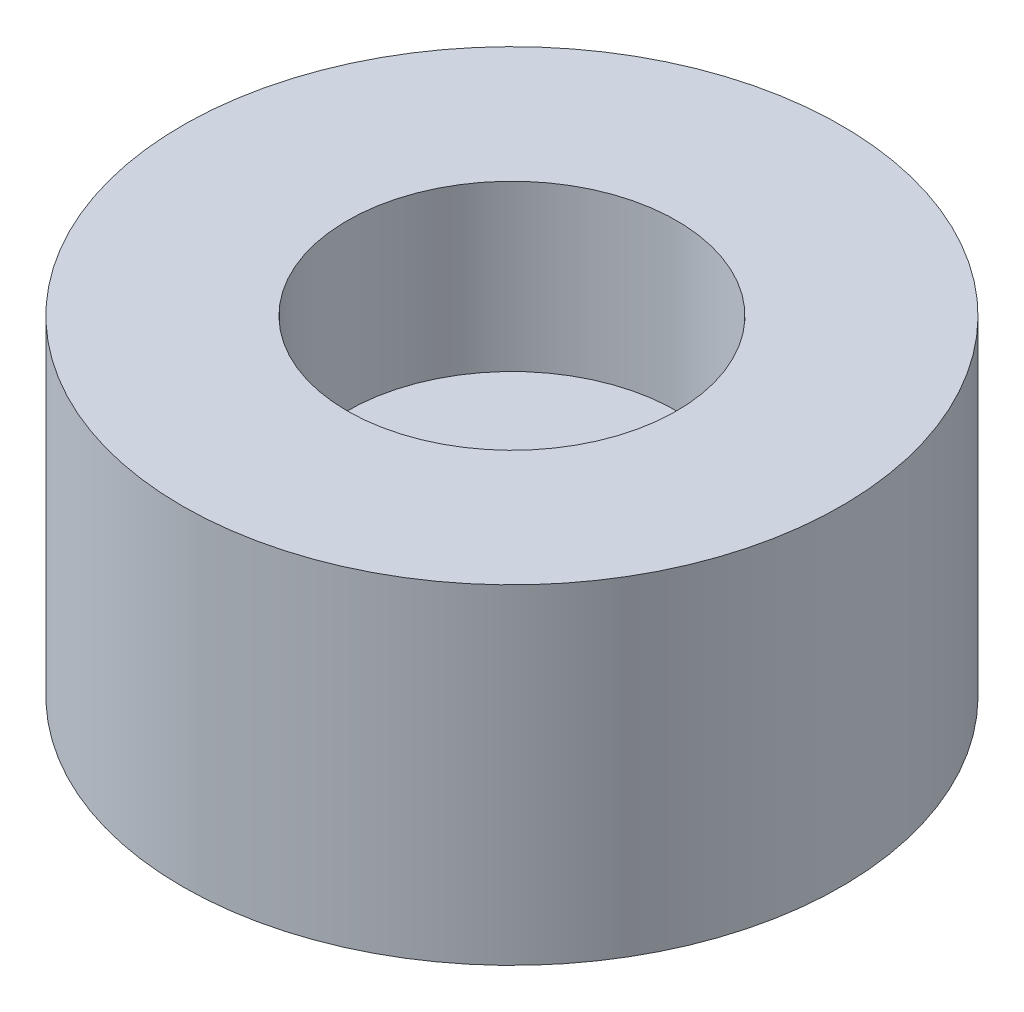
ISO-10303-21;
HEADER;
FILE_DESCRIPTION(('STEP AP214'),'2;1');
FILE_NAME('part.step','',(''),(''),'','','');
FILE_SCHEMA(('AUTOMOTIVE_DESIGN { 1 0 10303 214 1 1 1 1 }'));
ENDSEC;
DATA;
#1=APPLICATION_CONTEXT('core data for automotive mechanical design processes');
#2=APPLICATION_PROTOCOL_DEFINITION('international standard','automotive_design',2000,#1);
#3=PRODUCT_CONTEXT('',#1,'mechanical');
#4=PRODUCT('Part','Part','',(#3));
#5=PRODUCT_RELATED_PRODUCT_CATEGORY('part','',(#4));
#6=PRODUCT_DEFINITION_FORMATION('','',#4);
#7=PRODUCT_DEFINITION_CONTEXT('part definition',#1,'design');
#8=PRODUCT_DEFINITION('design','',#6,#7);
#9=PRODUCT_DEFINITION_SHAPE('','',#8);
#10=(LENGTH_UNIT() NAMED_UNIT(*) SI_UNIT(.MILLI.,.METRE.));
#11=(NAMED_UNIT(*) PLANE_ANGLE_UNIT() SI_UNIT($,.RADIAN.));
#12=(NAMED_UNIT(*) SI_UNIT($,.STERADIAN.) SOLID_ANGLE_UNIT());
#13=UNCERTAINTY_MEASURE_WITH_UNIT(LENGTH_MEASURE(1.E-05),#10,'distance_accuracy_value','');
#14=(GEOMETRIC_REPRESENTATION_CONTEXT(3) GLOBAL_UNCERTAINTY_ASSIGNED_CONTEXT((#13)) GLOBAL_UNIT_ASSIGNED_CONTEXT((#10,
#11,#12)) REPRESENTATION_CONTEXT('',''));
#15=CARTESIAN_POINT('',(0.,0.,0.));
#16=DIRECTION('',(0.,0.,1.));
#17=DIRECTION('',(1.,0.,0.));
#18=AXIS2_PLACEMENT_3D('',#15,#16,#17);
#19=CARTESIAN_POINT('',(0.,5.08,0.));
#20=DIRECTION('',(0.,-1.,0.));
#21=DIRECTION('',(0.,0.,-1.));
#22=AXIS2_PLACEMENT_3D('',#19,#20,#21);
#23=CYLINDRICAL_SURFACE('',#22,5.08);
#24=CARTESIAN_POINT('',(0.,5.08,0.));
#25=DIRECTION('',(0.,1.,0.));
#26=DIRECTION('',(0.,0.,1.));
#27=AXIS2_PLACEMENT_3D('',#24,#25,#26);
#28=CIRCLE('',#27,5.08);
#29=CARTESIAN_POINT('',(0.,5.08,5.08));
#30=VERTEX_POINT('',#29);
#31=EDGE_CURVE('E10',#30,#30,#28,.T.);
#32=ORIENTED_EDGE('',*,*,#31,.F.);
#33=EDGE_LOOP('',(#32));
#34=FACE_BOUND('',#33,.T.);
#35=CARTESIAN_POINT('',(0.,0.,0.));
#36=DIRECTION('',(0.,1.,0.));
#37=DIRECTION('',(0.,0.,1.));
#38=AXIS2_PLACEMENT_3D('',#35,#36,#37);
#39=CIRCLE('',#38,5.08);
#40=CARTESIAN_POINT('',(0.,0.,5.08));
#41=VERTEX_POINT('',#40);
#42=EDGE_CURVE('E34',#41,#41,#39,.T.);
#43=ORIENTED_EDGE('',*,*,#42,.T.);
#44=EDGE_LOOP('',(#43));
#45=FACE_BOUND('',#44,.T.);
#46=ADVANCED_FACE('F31',(#34,#45),#23,.T.);
#47=CARTESIAN_POINT('',(0.,5.08,0.));
#48=DIRECTION('',(0.,1.,0.));
#49=DIRECTION('',(0.,0.,1.));
#50=AXIS2_PLACEMENT_3D('',#47,#48,#49);
#51=PLANE('',#50);
#52=CARTESIAN_POINT('',(0.,5.08,0.));
#53=DIRECTION('',(0.,1.,0.));
#54=DIRECTION('',(0.,0.,1.));
#55=AXIS2_PLACEMENT_3D('',#52,#53,#54);
#56=CIRCLE('',#55,2.54);
#57=CARTESIAN_POINT('',(0.,5.08,2.54));
#58=VERTEX_POINT('',#57);
#59=EDGE_CURVE('E43',#58,#58,#56,.T.);
#60=ORIENTED_EDGE('',*,*,#59,.F.);
#61=EDGE_LOOP('',(#60));
#62=FACE_BOUND('',#61,.T.);
#63=ORIENTED_EDGE('',*,*,#31,.T.);
#64=EDGE_LOOP('',(#63));
#65=FACE_BOUND('',#64,.T.);
#66=ADVANCED_FACE('F58',(#62,#65),#51,.T.);
#67=CARTESIAN_POINT('',(0.,0.,0.));
#68=DIRECTION('',(0.,1.,0.));
#69=DIRECTION('',(0.,0.,1.));
#70=AXIS2_PLACEMENT_3D('',#67,#68,#69);
#71=PLANE('',#70);
#72=ORIENTED_EDGE('',*,*,#42,.F.);
#73=EDGE_LOOP('',(#72));
#74=FACE_BOUND('',#73,.T.);
#75=ADVANCED_FACE('F54',(#74),#71,.F.);
#76=CARTESIAN_POINT('',(0.,2.54,0.));
#77=DIRECTION('',(0.,1.,0.));
#78=DIRECTION('',(0.,0.,1.));
#79=AXIS2_PLACEMENT_3D('',#76,#77,#78);
#80=CYLINDRICAL_SURFACE('',#79,2.54);
#81=CARTESIAN_POINT('',(0.,2.54,0.));
#82=DIRECTION('',(0.,1.,0.));
#83=DIRECTION('',(0.,0.,1.));
#84=AXIS2_PLACEMENT_3D('',#81,#82,#83);
#85=CIRCLE('',#84,2.54);
#86=CARTESIAN_POINT('',(0.,2.54,2.54));
#87=VERTEX_POINT('',#86);
#88=EDGE_CURVE('E41',#87,#87,#85,.T.);
#89=ORIENTED_EDGE('',*,*,#88,.F.);
#90=EDGE_LOOP('',(#89));
#91=FACE_BOUND('',#90,.T.);
#92=ORIENTED_EDGE('',*,*,#59,.T.);
#93=EDGE_LOOP('',(#92));
#94=FACE_BOUND('',#93,.T.);
#95=ADVANCED_FACE('F51',(#91,#94),#80,.F.);
#96=CARTESIAN_POINT('',(0.,2.54,0.));
#97=DIRECTION('',(0.,1.,0.));
#98=DIRECTION('',(0.,0.,1.));
#99=AXIS2_PLACEMENT_3D('',#96,#97,#98);
#100=PLANE('',#99);
#101=ORIENTED_EDGE('',*,*,#88,.T.);
#102=EDGE_LOOP('',(#101));
#103=FACE_BOUND('',#102,.T.);
#104=ADVANCED_FACE('F49',(#103),#100,.T.);
#105=CLOSED_SHELL('',(#46,#66,#75,#95,#104));
#106=MANIFOLD_SOLID_BREP('B2',#105);
#107=ADVANCED_BREP_SHAPE_REPRESENTATION('',(#18,#106),#14);
#108=SHAPE_DEFINITION_REPRESENTATION(#9,#107);
ENDSEC;
END-ISO-10303-21;
